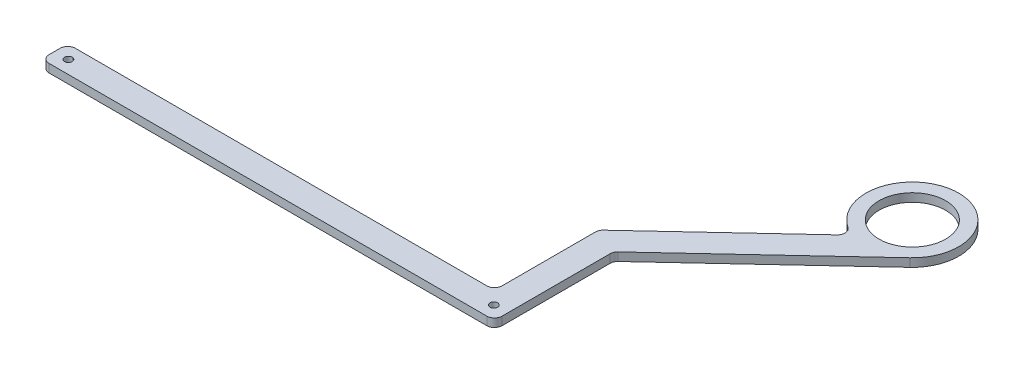
ISO-10303-21;
HEADER;
FILE_DESCRIPTION(('STEP AP214'),'2;1');
FILE_NAME('part.step','',(''),(''),'','','');
FILE_SCHEMA(('AUTOMOTIVE_DESIGN { 1 0 10303 214 1 1 1 1 }'));
ENDSEC;
DATA;
#1=APPLICATION_CONTEXT('core data for automotive mechanical design processes');
#2=APPLICATION_PROTOCOL_DEFINITION('international standard','automotive_design',2000,#1);
#3=PRODUCT_CONTEXT('',#1,'mechanical');
#4=PRODUCT('Part','Part','',(#3));
#5=PRODUCT_RELATED_PRODUCT_CATEGORY('part','',(#4));
#6=PRODUCT_DEFINITION_FORMATION('','',#4);
#7=PRODUCT_DEFINITION_CONTEXT('part definition',#1,'design');
#8=PRODUCT_DEFINITION('design','',#6,#7);
#9=PRODUCT_DEFINITION_SHAPE('','',#8);
#10=(LENGTH_UNIT() NAMED_UNIT(*) SI_UNIT(.MILLI.,.METRE.));
#11=(NAMED_UNIT(*) PLANE_ANGLE_UNIT() SI_UNIT($,.RADIAN.));
#12=(NAMED_UNIT(*) SI_UNIT($,.STERADIAN.) SOLID_ANGLE_UNIT());
#13=UNCERTAINTY_MEASURE_WITH_UNIT(LENGTH_MEASURE(1.E-05),#10,'distance_accuracy_value','');
#14=(GEOMETRIC_REPRESENTATION_CONTEXT(3) GLOBAL_UNCERTAINTY_ASSIGNED_CONTEXT((#13)) GLOBAL_UNIT_ASSIGNED_CONTEXT((#10,
#11,#12)) REPRESENTATION_CONTEXT('',''));
#15=CARTESIAN_POINT('',(0.,0.,0.));
#16=DIRECTION('',(0.,0.,1.));
#17=DIRECTION('',(1.,0.,0.));
#18=AXIS2_PLACEMENT_3D('',#15,#16,#17);
#19=CARTESIAN_POINT('',(219.136925156428,3.175,-112.894829323659));
#20=DIRECTION('',(0.,1.,0.));
#21=DIRECTION('',(0.,0.,1.));
#22=AXIS2_PLACEMENT_3D('',#19,#20,#21);
#23=PLANE('',#22);
#24=CARTESIAN_POINT('',(167.45,3.175,-5.));
#25=DIRECTION('',(0.,1.,0.));
#26=DIRECTION('',(0.,0.,1.));
#27=AXIS2_PLACEMENT_3D('',#24,#25,#26);
#28=CIRCLE('',#27,1.4605);
#29=CARTESIAN_POINT('',(167.45,3.175,-3.5395));
#30=VERTEX_POINT('',#29);
#31=EDGE_CURVE('E348',#30,#30,#28,.T.);
#32=ORIENTED_EDGE('',*,*,#31,.F.);
#33=EDGE_LOOP('',(#32));
#34=FACE_BOUND('',#33,.T.);
#35=DIRECTION('',(-0.731353701619171,0.,0.681998360062497));
#36=VECTOR('',#35,1.);
#37=CARTESIAN_POINT('',(212.732452536377,3.175,-96.3941405362471));
#38=LINE('',#37,#36);
#39=CARTESIAN_POINT('',(209.71766352743,3.175,-93.5828043038821));
#40=VERTEX_POINT('',#39);
#41=CARTESIAN_POINT('',(163.628882790257,3.175,-50.604320964778));
#42=VERTEX_POINT('',#41);
#43=EDGE_CURVE('E172',#40,#42,#38,.T.);
#44=ORIENTED_EDGE('',*,*,#43,.T.);
#45=CARTESIAN_POINT('',(165.621,3.175,-48.4680368023484));
#46=DIRECTION('',(0.,1.,0.));
#47=DIRECTION('',(0.,0.,1.));
#48=AXIS2_PLACEMENT_3D('',#45,#46,#47);
#49=CIRCLE('',#48,2.921);
#50=CARTESIAN_POINT('',(162.7,3.175,-48.4680368023484));
#51=VERTEX_POINT('',#50);
#52=EDGE_CURVE('E226',#42,#51,#49,.T.);
#53=ORIENTED_EDGE('',*,*,#52,.T.);
#54=DIRECTION('',(0.,0.,1.));
#55=VECTOR('',#54,1.);
#56=CARTESIAN_POINT('',(162.7,3.175,-49.7381237496093));
#57=LINE('',#56,#55);
#58=CARTESIAN_POINT('',(162.7,3.175,-12.921));
#59=VERTEX_POINT('',#58);
#60=EDGE_CURVE('E174',#51,#59,#57,.T.);
#61=ORIENTED_EDGE('',*,*,#60,.T.);
#62=CARTESIAN_POINT('',(159.779,3.175,-12.921));
#63=DIRECTION('',(0.,1.,0.));
#64=DIRECTION('',(0.,0.,1.));
#65=AXIS2_PLACEMENT_3D('',#62,#63,#64);
#66=CIRCLE('',#65,2.921);
#67=CARTESIAN_POINT('',(159.779,3.175,-10.));
#68=VERTEX_POINT('',#67);
#69=EDGE_CURVE('E59',#59,#68,#66,.F.);
#70=ORIENTED_EDGE('',*,*,#69,.T.);
#71=DIRECTION('',(-1.,0.,0.));
#72=VECTOR('',#71,1.);
#73=CARTESIAN_POINT('',(162.7,3.175,-10.));
#74=LINE('',#73,#72);
#75=CARTESIAN_POINT('',(2.92100000000001,3.175,-10.));
#76=VERTEX_POINT('',#75);
#77=EDGE_CURVE('E167',#68,#76,#74,.T.);
#78=ORIENTED_EDGE('',*,*,#77,.T.);
#79=CARTESIAN_POINT('',(2.921,3.175,-7.079));
#80=DIRECTION('',(0.,1.,0.));
#81=DIRECTION('',(0.,0.,1.));
#82=AXIS2_PLACEMENT_3D('',#79,#80,#81);
#83=CIRCLE('',#82,2.921);
#84=CARTESIAN_POINT('',(0.,3.175,-7.079));
#85=VERTEX_POINT('',#84);
#86=EDGE_CURVE('E222',#76,#85,#83,.T.);
#87=ORIENTED_EDGE('',*,*,#86,.T.);
#88=DIRECTION('',(0.,0.,1.));
#89=VECTOR('',#88,1.);
#90=CARTESIAN_POINT('',(0.,3.175,-10.));
#91=LINE('',#90,#89);
#92=CARTESIAN_POINT('',(0.,3.175,-2.921));
#93=VERTEX_POINT('',#92);
#94=EDGE_CURVE('E200',#85,#93,#91,.T.);
#95=ORIENTED_EDGE('',*,*,#94,.T.);
#96=CARTESIAN_POINT('',(2.921,3.175,-2.921));
#97=DIRECTION('',(0.,1.,0.));
#98=DIRECTION('',(0.,0.,1.));
#99=AXIS2_PLACEMENT_3D('',#96,#97,#98);
#100=CIRCLE('',#99,2.921);
#101=CARTESIAN_POINT('',(2.921,3.175,0.));
#102=VERTEX_POINT('',#101);
#103=EDGE_CURVE('E224',#93,#102,#100,.T.);
#104=ORIENTED_EDGE('',*,*,#103,.T.);
#105=DIRECTION('',(1.,0.,0.));
#106=VECTOR('',#105,1.);
#107=CARTESIAN_POINT('',(0.,3.175,0.));
#108=LINE('',#107,#106);
#109=CARTESIAN_POINT('',(169.779,3.175,0.));
#110=VERTEX_POINT('',#109);
#111=EDGE_CURVE('E337',#102,#110,#108,.T.);
#112=ORIENTED_EDGE('',*,*,#111,.T.);
#113=CARTESIAN_POINT('',(169.779,3.175,-2.921));
#114=DIRECTION('',(0.,1.,0.));
#115=DIRECTION('',(0.,0.,1.));
#116=AXIS2_PLACEMENT_3D('',#113,#114,#115);
#117=CIRCLE('',#116,2.921);
#118=CARTESIAN_POINT('',(172.7,3.175,-2.921));
#119=VERTEX_POINT('',#118);
#120=EDGE_CURVE('E220',#110,#119,#117,.T.);
#121=ORIENTED_EDGE('',*,*,#120,.T.);
#122=DIRECTION('',(0.,0.,-1.));
#123=VECTOR('',#122,1.);
#124=CARTESIAN_POINT('',(172.7,3.175,0.));
#125=LINE('',#124,#123);
#126=CARTESIAN_POINT('',(172.7,3.175,-44.1199130527391));
#127=VERTEX_POINT('',#126);
#128=EDGE_CURVE('E156',#119,#127,#125,.T.);
#129=ORIENTED_EDGE('',*,*,#128,.T.);
#130=CARTESIAN_POINT('',(175.621,3.175,-44.1199130527391));
#131=DIRECTION('',(0.,1.,0.));
#132=DIRECTION('',(0.,0.,1.));
#133=AXIS2_PLACEMENT_3D('',#130,#131,#132);
#134=CIRCLE('',#133,2.921);
#135=CARTESIAN_POINT('',(173.628882790257,3.175,-46.2561972151687));
#136=VERTEX_POINT('',#135);
#137=EDGE_CURVE('E11',#127,#136,#134,.F.);
#138=ORIENTED_EDGE('',*,*,#137,.T.);
#139=DIRECTION('',(0.731353701619172,0.,-0.681998360062497));
#140=VECTOR('',#139,1.);
#141=CARTESIAN_POINT('',(172.7,3.175,-45.39));
#142=LINE('',#141,#140);
#143=CARTESIAN_POINT('',(231.208296129534,3.175,-99.9498688049997));
#144=VERTEX_POINT('',#143);
#145=EDGE_CURVE('E144',#136,#144,#142,.T.);
#146=ORIENTED_EDGE('',*,*,#145,.T.);
#147=CARTESIAN_POINT('',(219.136925156428,3.175,-112.894829323659));
#148=DIRECTION('',(0.,1.,0.));
#149=DIRECTION('',(0.,0.,1.));
#150=AXIS2_PLACEMENT_3D('',#147,#148,#149);
#151=CIRCLE('',#150,17.7);
#152=CARTESIAN_POINT('',(209.3419876924,3.175,-98.1520616026441));
#153=VERTEX_POINT('',#152);
#154=EDGE_CURVE('E149',#144,#153,#151,.T.);
#155=ORIENTED_EDGE('',*,*,#154,.T.);
#156=CARTESIAN_POINT('',(207.725546317687,3.175,-95.7190884663117));
#157=DIRECTION('',(0.,1.,0.));
#158=DIRECTION('',(0.,0.,1.));
#159=AXIS2_PLACEMENT_3D('',#156,#157,#158);
#160=CIRCLE('',#159,2.921);
#161=EDGE_CURVE('E251',#153,#40,#160,.F.);
#162=ORIENTED_EDGE('',*,*,#161,.T.);
#163=EDGE_LOOP('',(#44,#53,#61,#70,#78,#87,#95,#104,#112,#121,#129,#138,#146,#155,#162));
#164=FACE_BOUND('',#163,.T.);
#165=CARTESIAN_POINT('',(5.25,3.175,-5.));
#166=DIRECTION('',(0.,1.,0.));
#167=DIRECTION('',(0.,0.,1.));
#168=AXIS2_PLACEMENT_3D('',#165,#166,#167);
#169=CIRCLE('',#168,1.4605);
#170=CARTESIAN_POINT('',(5.25,3.175,-3.5395));
#171=VERTEX_POINT('',#170);
#172=EDGE_CURVE('E184',#171,#171,#169,.T.);
#173=ORIENTED_EDGE('',*,*,#172,.F.);
#174=EDGE_LOOP('',(#173));
#175=FACE_BOUND('',#174,.T.);
#176=CARTESIAN_POINT('',(219.136925156428,3.175,-112.894829323659));
#177=DIRECTION('',(0.,1.,0.));
#178=DIRECTION('',(0.,0.,1.));
#179=AXIS2_PLACEMENT_3D('',#176,#177,#178);
#180=CIRCLE('',#179,12.7);
#181=CARTESIAN_POINT('',(219.136925156428,3.175,-100.194829323659));
#182=VERTEX_POINT('',#181);
#183=EDGE_CURVE('E354',#182,#182,#180,.T.);
#184=ORIENTED_EDGE('',*,*,#183,.F.);
#185=EDGE_LOOP('',(#184));
#186=FACE_BOUND('',#185,.T.);
#187=ADVANCED_FACE('F37',(#34,#164,#175,#186),#23,.T.);
#188=CARTESIAN_POINT('',(219.136925156428,0.,-112.894829323659));
#189=DIRECTION('',(0.,1.,0.));
#190=DIRECTION('',(0.,0.,1.));
#191=AXIS2_PLACEMENT_3D('',#188,#189,#190);
#192=PLANE('',#191);
#193=DIRECTION('',(0.,0.,1.));
#194=VECTOR('',#193,1.);
#195=CARTESIAN_POINT('',(162.7,0.,-49.7381237496093));
#196=LINE('',#195,#194);
#197=CARTESIAN_POINT('',(162.7,0.,-48.4680368023484));
#198=VERTEX_POINT('',#197);
#199=CARTESIAN_POINT('',(162.7,0.,-12.921));
#200=VERTEX_POINT('',#199);
#201=EDGE_CURVE('E196',#198,#200,#196,.T.);
#202=ORIENTED_EDGE('',*,*,#201,.F.);
#203=CARTESIAN_POINT('',(165.621,0.,-48.4680368023484));
#204=DIRECTION('',(0.,1.,0.));
#205=DIRECTION('',(0.,0.,1.));
#206=AXIS2_PLACEMENT_3D('',#203,#204,#205);
#207=CIRCLE('',#206,2.921);
#208=CARTESIAN_POINT('',(163.628882790257,0.,-50.604320964778));
#209=VERTEX_POINT('',#208);
#210=EDGE_CURVE('E218',#198,#209,#207,.F.);
#211=ORIENTED_EDGE('',*,*,#210,.T.);
#212=DIRECTION('',(-0.731353701619171,0.,0.681998360062497));
#213=VECTOR('',#212,1.);
#214=CARTESIAN_POINT('',(212.732452536377,0.,-96.3941405362471));
#215=LINE('',#214,#213);
#216=CARTESIAN_POINT('',(209.71766352743,0.,-93.5828043038821));
#217=VERTEX_POINT('',#216);
#218=EDGE_CURVE('E193',#217,#209,#215,.T.);
#219=ORIENTED_EDGE('',*,*,#218,.F.);
#220=CARTESIAN_POINT('',(207.725546317687,0.,-95.7190884663117));
#221=DIRECTION('',(0.,1.,0.));
#222=DIRECTION('',(0.,0.,1.));
#223=AXIS2_PLACEMENT_3D('',#220,#221,#222);
#224=CIRCLE('',#223,2.921);
#225=CARTESIAN_POINT('',(209.3419876924,0.,-98.1520616026441));
#226=VERTEX_POINT('',#225);
#227=EDGE_CURVE('E249',#217,#226,#224,.T.);
#228=ORIENTED_EDGE('',*,*,#227,.T.);
#229=CARTESIAN_POINT('',(219.136925156428,0.,-112.894829323659));
#230=DIRECTION('',(0.,1.,0.));
#231=DIRECTION('',(0.,0.,1.));
#232=AXIS2_PLACEMENT_3D('',#229,#230,#231);
#233=CIRCLE('',#232,17.7);
#234=CARTESIAN_POINT('',(231.208296129534,0.,-99.9498688049997));
#235=VERTEX_POINT('',#234);
#236=EDGE_CURVE('E191',#235,#226,#233,.T.);
#237=ORIENTED_EDGE('',*,*,#236,.F.);
#238=DIRECTION('',(0.731353701619172,0.,-0.681998360062497));
#239=VECTOR('',#238,1.);
#240=CARTESIAN_POINT('',(172.7,0.,-45.39));
#241=LINE('',#240,#239);
#242=CARTESIAN_POINT('',(173.628882790257,0.,-46.2561972151687));
#243=VERTEX_POINT('',#242);
#244=EDGE_CURVE('E162',#243,#235,#241,.T.);
#245=ORIENTED_EDGE('',*,*,#244,.F.);
#246=CARTESIAN_POINT('',(175.621,0.,-44.1199130527391));
#247=DIRECTION('',(0.,1.,0.));
#248=DIRECTION('',(0.,0.,1.));
#249=AXIS2_PLACEMENT_3D('',#246,#247,#248);
#250=CIRCLE('',#249,2.921);
#251=CARTESIAN_POINT('',(172.7,0.,-44.1199130527391));
#252=VERTEX_POINT('',#251);
#253=EDGE_CURVE('E45',#243,#252,#250,.T.);
#254=ORIENTED_EDGE('',*,*,#253,.T.);
#255=DIRECTION('',(0.,0.,-1.));
#256=VECTOR('',#255,1.);
#257=CARTESIAN_POINT('',(172.7,0.,0.));
#258=LINE('',#257,#256);
#259=CARTESIAN_POINT('',(172.7,0.,-2.921));
#260=VERTEX_POINT('',#259);
#261=EDGE_CURVE('E187',#260,#252,#258,.T.);
#262=ORIENTED_EDGE('',*,*,#261,.F.);
#263=CARTESIAN_POINT('',(169.779,0.,-2.921));
#264=DIRECTION('',(0.,1.,0.));
#265=DIRECTION('',(0.,0.,1.));
#266=AXIS2_PLACEMENT_3D('',#263,#264,#265);
#267=CIRCLE('',#266,2.921);
#268=CARTESIAN_POINT('',(169.779,0.,0.));
#269=VERTEX_POINT('',#268);
#270=EDGE_CURVE('E212',#260,#269,#267,.F.);
#271=ORIENTED_EDGE('',*,*,#270,.T.);
#272=DIRECTION('',(1.,0.,0.));
#273=VECTOR('',#272,1.);
#274=CARTESIAN_POINT('',(0.,0.,0.));
#275=LINE('',#274,#273);
#276=CARTESIAN_POINT('',(2.921,0.,0.));
#277=VERTEX_POINT('',#276);
#278=EDGE_CURVE('E183',#277,#269,#275,.T.);
#279=ORIENTED_EDGE('',*,*,#278,.F.);
#280=CARTESIAN_POINT('',(2.921,0.,-2.921));
#281=DIRECTION('',(0.,1.,0.));
#282=DIRECTION('',(0.,0.,1.));
#283=AXIS2_PLACEMENT_3D('',#280,#281,#282);
#284=CIRCLE('',#283,2.921);
#285=CARTESIAN_POINT('',(0.,0.,-2.921));
#286=VERTEX_POINT('',#285);
#287=EDGE_CURVE('E216',#277,#286,#284,.F.);
#288=ORIENTED_EDGE('',*,*,#287,.T.);
#289=DIRECTION('',(0.,0.,1.));
#290=VECTOR('',#289,1.);
#291=CARTESIAN_POINT('',(0.,0.,-10.));
#292=LINE('',#291,#290);
#293=CARTESIAN_POINT('',(0.,0.,-7.079));
#294=VERTEX_POINT('',#293);
#295=EDGE_CURVE('E180',#294,#286,#292,.T.);
#296=ORIENTED_EDGE('',*,*,#295,.F.);
#297=CARTESIAN_POINT('',(2.921,0.,-7.079));
#298=DIRECTION('',(0.,1.,0.));
#299=DIRECTION('',(0.,0.,1.));
#300=AXIS2_PLACEMENT_3D('',#297,#298,#299);
#301=CIRCLE('',#300,2.921);
#302=CARTESIAN_POINT('',(2.92100000000001,0.,-10.));
#303=VERTEX_POINT('',#302);
#304=EDGE_CURVE('E214',#294,#303,#301,.F.);
#305=ORIENTED_EDGE('',*,*,#304,.T.);
#306=DIRECTION('',(-1.,0.,0.));
#307=VECTOR('',#306,1.);
#308=CARTESIAN_POINT('',(162.7,0.,-10.));
#309=LINE('',#308,#307);
#310=CARTESIAN_POINT('',(159.779,0.,-10.));
#311=VERTEX_POINT('',#310);
#312=EDGE_CURVE('E199',#311,#303,#309,.T.);
#313=ORIENTED_EDGE('',*,*,#312,.F.);
#314=CARTESIAN_POINT('',(159.779,0.,-12.921));
#315=DIRECTION('',(0.,1.,0.));
#316=DIRECTION('',(0.,0.,1.));
#317=AXIS2_PLACEMENT_3D('',#314,#315,#316);
#318=CIRCLE('',#317,2.921);
#319=EDGE_CURVE('E253',#311,#200,#318,.T.);
#320=ORIENTED_EDGE('',*,*,#319,.T.);
#321=EDGE_LOOP('',(#202,#211,#219,#228,#237,#245,#254,#262,#271,#279,#288,#296,#305,#313,#320));
#322=FACE_BOUND('',#321,.T.);
#323=CARTESIAN_POINT('',(5.25,0.,-5.));
#324=DIRECTION('',(0.,1.,0.));
#325=DIRECTION('',(0.,0.,1.));
#326=AXIS2_PLACEMENT_3D('',#323,#324,#325);
#327=CIRCLE('',#326,1.4605);
#328=CARTESIAN_POINT('',(5.25,0.,-3.5395));
#329=VERTEX_POINT('',#328);
#330=EDGE_CURVE('E345',#329,#329,#327,.T.);
#331=ORIENTED_EDGE('',*,*,#330,.T.);
#332=EDGE_LOOP('',(#331));
#333=FACE_BOUND('',#332,.T.);
#334=CARTESIAN_POINT('',(167.45,0.,-5.));
#335=DIRECTION('',(0.,1.,0.));
#336=DIRECTION('',(0.,0.,1.));
#337=AXIS2_PLACEMENT_3D('',#334,#335,#336);
#338=CIRCLE('',#337,1.4605);
#339=CARTESIAN_POINT('',(167.45,0.,-3.5395));
#340=VERTEX_POINT('',#339);
#341=EDGE_CURVE('E351',#340,#340,#338,.T.);
#342=ORIENTED_EDGE('',*,*,#341,.T.);
#343=EDGE_LOOP('',(#342));
#344=FACE_BOUND('',#343,.T.);
#345=CARTESIAN_POINT('',(219.136925156428,0.,-112.894829323659));
#346=DIRECTION('',(0.,1.,0.));
#347=DIRECTION('',(0.,0.,1.));
#348=AXIS2_PLACEMENT_3D('',#345,#346,#347);
#349=CIRCLE('',#348,12.7);
#350=CARTESIAN_POINT('',(219.136925156428,0.,-100.194829323659));
#351=VERTEX_POINT('',#350);
#352=EDGE_CURVE('E357',#351,#351,#349,.T.);
#353=ORIENTED_EDGE('',*,*,#352,.T.);
#354=EDGE_LOOP('',(#353));
#355=FACE_BOUND('',#354,.T.);
#356=ADVANCED_FACE('F258',(#322,#333,#344,#355),#192,.F.);
#357=CARTESIAN_POINT('',(0.,3.175,-10.));
#358=DIRECTION('',(1.,0.,0.));
#359=DIRECTION('',(0.,0.,-1.));
#360=AXIS2_PLACEMENT_3D('',#357,#358,#359);
#361=PLANE('',#360);
#362=ORIENTED_EDGE('',*,*,#295,.T.);
#363=DIRECTION('',(0.,-1.,0.));
#364=VECTOR('',#363,1.);
#365=CARTESIAN_POINT('',(0.,3.175,-2.921));
#366=LINE('',#365,#364);
#367=EDGE_CURVE('E240',#286,#93,#366,.F.);
#368=ORIENTED_EDGE('',*,*,#367,.T.);
#369=ORIENTED_EDGE('',*,*,#94,.F.);
#370=DIRECTION('',(0.,-1.,0.));
#371=VECTOR('',#370,1.);
#372=CARTESIAN_POINT('',(0.,3.175,-7.079));
#373=LINE('',#372,#371);
#374=EDGE_CURVE('E237',#85,#294,#373,.T.);
#375=ORIENTED_EDGE('',*,*,#374,.T.);
#376=EDGE_LOOP('',(#362,#368,#369,#375));
#377=FACE_BOUND('',#376,.T.);
#378=ADVANCED_FACE('F283',(#377),#361,.F.);
#379=CARTESIAN_POINT('',(0.,3.175,0.));
#380=DIRECTION('',(0.,0.,-1.));
#381=DIRECTION('',(-1.,0.,0.));
#382=AXIS2_PLACEMENT_3D('',#379,#380,#381);
#383=PLANE('',#382);
#384=ORIENTED_EDGE('',*,*,#111,.F.);
#385=DIRECTION('',(0.,-1.,0.));
#386=VECTOR('',#385,1.);
#387=CARTESIAN_POINT('',(2.921,3.175,0.));
#388=LINE('',#387,#386);
#389=EDGE_CURVE('E234',#102,#277,#388,.T.);
#390=ORIENTED_EDGE('',*,*,#389,.T.);
#391=ORIENTED_EDGE('',*,*,#278,.T.);
#392=DIRECTION('',(0.,-1.,0.));
#393=VECTOR('',#392,1.);
#394=CARTESIAN_POINT('',(169.779,3.175,0.));
#395=LINE('',#394,#393);
#396=EDGE_CURVE('E232',#269,#110,#395,.F.);
#397=ORIENTED_EDGE('',*,*,#396,.T.);
#398=EDGE_LOOP('',(#384,#390,#391,#397));
#399=FACE_BOUND('',#398,.T.);
#400=ADVANCED_FACE('F307',(#399),#383,.F.);
#401=CARTESIAN_POINT('',(172.7,3.175,0.));
#402=DIRECTION('',(-1.,0.,0.));
#403=DIRECTION('',(0.,0.,1.));
#404=AXIS2_PLACEMENT_3D('',#401,#402,#403);
#405=PLANE('',#404);
#406=ORIENTED_EDGE('',*,*,#261,.T.);
#407=DIRECTION('',(0.,-1.,0.));
#408=VECTOR('',#407,1.);
#409=CARTESIAN_POINT('',(172.7,3.175,-44.1199130527391));
#410=LINE('',#409,#408);
#411=EDGE_CURVE('E247',#252,#127,#410,.F.);
#412=ORIENTED_EDGE('',*,*,#411,.T.);
#413=ORIENTED_EDGE('',*,*,#128,.F.);
#414=DIRECTION('',(0.,-1.,0.));
#415=VECTOR('',#414,1.);
#416=CARTESIAN_POINT('',(172.7,3.175,-2.921));
#417=LINE('',#416,#415);
#418=EDGE_CURVE('E244',#119,#260,#417,.T.);
#419=ORIENTED_EDGE('',*,*,#418,.T.);
#420=EDGE_LOOP('',(#406,#412,#413,#419));
#421=FACE_BOUND('',#420,.T.);
#422=ADVANCED_FACE('F263',(#421),#405,.F.);
#423=CARTESIAN_POINT('',(172.7,3.175,-45.39));
#424=DIRECTION('',(-0.681998360062497,0.,-0.731353701619172));
#425=DIRECTION('',(-0.731353701619172,0.,0.681998360062497));
#426=AXIS2_PLACEMENT_3D('',#423,#424,#425);
#427=PLANE('',#426);
#428=ORIENTED_EDGE('',*,*,#145,.F.);
#429=DIRECTION('',(0.,-1.,0.));
#430=VECTOR('',#429,1.);
#431=CARTESIAN_POINT('',(173.628882790257,0.,-46.2561972151687));
#432=LINE('',#431,#430);
#433=EDGE_CURVE('E242',#136,#243,#432,.T.);
#434=ORIENTED_EDGE('',*,*,#433,.T.);
#435=ORIENTED_EDGE('',*,*,#244,.T.);
#436=DIRECTION('',(0.,-1.,0.));
#437=VECTOR('',#436,1.);
#438=CARTESIAN_POINT('',(231.208296129534,3.175,-99.9498688049997));
#439=LINE('',#438,#437);
#440=EDGE_CURVE('E159',#144,#235,#439,.T.);
#441=ORIENTED_EDGE('',*,*,#440,.F.);
#442=EDGE_LOOP('',(#428,#434,#435,#441));
#443=FACE_BOUND('',#442,.T.);
#444=ADVANCED_FACE('F160',(#443),#427,.F.);
#445=CARTESIAN_POINT('',(219.136925156428,3.175,-112.894829323659));
#446=DIRECTION('',(0.,-1.,0.));
#447=DIRECTION('',(0.,0.,-1.));
#448=AXIS2_PLACEMENT_3D('',#445,#446,#447);
#449=CYLINDRICAL_SURFACE('',#448,17.7);
#450=ORIENTED_EDGE('',*,*,#236,.T.);
#451=DIRECTION('',(0.,-1.,0.));
#452=VECTOR('',#451,1.);
#453=CARTESIAN_POINT('',(209.3419876924,3.175,-98.1520616026441));
#454=LINE('',#453,#452);
#455=EDGE_CURVE('E171',#226,#153,#454,.F.);
#456=ORIENTED_EDGE('',*,*,#455,.T.);
#457=ORIENTED_EDGE('',*,*,#154,.F.);
#458=ORIENTED_EDGE('',*,*,#440,.T.);
#459=EDGE_LOOP('',(#450,#456,#457,#458));
#460=FACE_BOUND('',#459,.T.);
#461=ADVANCED_FACE('F169',(#460),#449,.T.);
#462=CARTESIAN_POINT('',(212.732452536377,3.175,-96.3941405362471));
#463=DIRECTION('',(0.681998360062497,0.,0.731353701619171));
#464=DIRECTION('',(0.731353701619171,0.,-0.681998360062497));
#465=AXIS2_PLACEMENT_3D('',#462,#463,#464);
#466=PLANE('',#465);
#467=ORIENTED_EDGE('',*,*,#43,.F.);
#468=DIRECTION('',(0.,1.,0.));
#469=VECTOR('',#468,1.);
#470=CARTESIAN_POINT('',(209.71766352743,0.,-93.5828043038821));
#471=LINE('',#470,#469);
#472=EDGE_CURVE('E203',#40,#217,#471,.F.);
#473=ORIENTED_EDGE('',*,*,#472,.T.);
#474=ORIENTED_EDGE('',*,*,#218,.T.);
#475=DIRECTION('',(0.,-1.,0.));
#476=VECTOR('',#475,1.);
#477=CARTESIAN_POINT('',(163.628882790257,3.175,-50.604320964778));
#478=LINE('',#477,#476);
#479=EDGE_CURVE('E166',#209,#42,#478,.F.);
#480=ORIENTED_EDGE('',*,*,#479,.T.);
#481=EDGE_LOOP('',(#467,#473,#474,#480));
#482=FACE_BOUND('',#481,.T.);
#483=ADVANCED_FACE('F296',(#482),#466,.F.);
#484=CARTESIAN_POINT('',(162.7,3.175,-49.7381237496093));
#485=DIRECTION('',(1.,0.,0.));
#486=DIRECTION('',(0.,0.,-1.));
#487=AXIS2_PLACEMENT_3D('',#484,#485,#486);
#488=PLANE('',#487);
#489=ORIENTED_EDGE('',*,*,#60,.F.);
#490=DIRECTION('',(0.,-1.,0.));
#491=VECTOR('',#490,1.);
#492=CARTESIAN_POINT('',(162.7,3.175,-48.4680368023484));
#493=LINE('',#492,#491);
#494=EDGE_CURVE('E209',#51,#198,#493,.T.);
#495=ORIENTED_EDGE('',*,*,#494,.T.);
#496=ORIENTED_EDGE('',*,*,#201,.T.);
#497=DIRECTION('',(0.,-1.,0.));
#498=VECTOR('',#497,1.);
#499=CARTESIAN_POINT('',(162.7,3.175,-12.921));
#500=LINE('',#499,#498);
#501=EDGE_CURVE('E207',#200,#59,#500,.F.);
#502=ORIENTED_EDGE('',*,*,#501,.T.);
#503=EDGE_LOOP('',(#489,#495,#496,#502));
#504=FACE_BOUND('',#503,.T.);
#505=ADVANCED_FACE('F293',(#504),#488,.F.);
#506=CARTESIAN_POINT('',(162.7,3.175,-10.));
#507=DIRECTION('',(0.,0.,1.));
#508=DIRECTION('',(1.,0.,0.));
#509=AXIS2_PLACEMENT_3D('',#506,#507,#508);
#510=PLANE('',#509);
#511=ORIENTED_EDGE('',*,*,#77,.F.);
#512=DIRECTION('',(0.,-1.,0.));
#513=VECTOR('',#512,1.);
#514=CARTESIAN_POINT('',(159.779,0.,-10.));
#515=LINE('',#514,#513);
#516=EDGE_CURVE('E229',#68,#311,#515,.T.);
#517=ORIENTED_EDGE('',*,*,#516,.T.);
#518=ORIENTED_EDGE('',*,*,#312,.T.);
#519=DIRECTION('',(0.,-1.,0.));
#520=VECTOR('',#519,1.);
#521=CARTESIAN_POINT('',(2.92100000000001,3.175,-10.));
#522=LINE('',#521,#520);
#523=EDGE_CURVE('E52',#303,#76,#522,.F.);
#524=ORIENTED_EDGE('',*,*,#523,.T.);
#525=EDGE_LOOP('',(#511,#517,#518,#524));
#526=FACE_BOUND('',#525,.T.);
#527=ADVANCED_FACE('F290',(#526),#510,.F.);
#528=CARTESIAN_POINT('',(5.25,3.175,-5.));
#529=DIRECTION('',(0.,-1.,0.));
#530=DIRECTION('',(0.,0.,-1.));
#531=AXIS2_PLACEMENT_3D('',#528,#529,#530);
#532=CYLINDRICAL_SURFACE('',#531,1.4605);
#533=ORIENTED_EDGE('',*,*,#172,.T.);
#534=EDGE_LOOP('',(#533));
#535=FACE_BOUND('',#534,.T.);
#536=ORIENTED_EDGE('',*,*,#330,.F.);
#537=EDGE_LOOP('',(#536));
#538=FACE_BOUND('',#537,.T.);
#539=ADVANCED_FACE('F287',(#535,#538),#532,.F.);
#540=CARTESIAN_POINT('',(167.45,3.175,-5.));
#541=DIRECTION('',(0.,-1.,0.));
#542=DIRECTION('',(0.,0.,-1.));
#543=AXIS2_PLACEMENT_3D('',#540,#541,#542);
#544=CYLINDRICAL_SURFACE('',#543,1.4605);
#545=ORIENTED_EDGE('',*,*,#31,.T.);
#546=EDGE_LOOP('',(#545));
#547=FACE_BOUND('',#546,.T.);
#548=ORIENTED_EDGE('',*,*,#341,.F.);
#549=EDGE_LOOP('',(#548));
#550=FACE_BOUND('',#549,.T.);
#551=ADVANCED_FACE('F366',(#547,#550),#544,.F.);
#552=CARTESIAN_POINT('',(219.136925156428,3.175,-112.894829323659));
#553=DIRECTION('',(0.,-1.,0.));
#554=DIRECTION('',(0.,0.,-1.));
#555=AXIS2_PLACEMENT_3D('',#552,#553,#554);
#556=CYLINDRICAL_SURFACE('',#555,12.7);
#557=ORIENTED_EDGE('',*,*,#183,.T.);
#558=EDGE_LOOP('',(#557));
#559=FACE_BOUND('',#558,.T.);
#560=ORIENTED_EDGE('',*,*,#352,.F.);
#561=EDGE_LOOP('',(#560));
#562=FACE_BOUND('',#561,.T.);
#563=ADVANCED_FACE('F318',(#559,#562),#556,.F.);
#564=CARTESIAN_POINT('',(207.725546317687,3.175,-95.7190884663117));
#565=DIRECTION('',(0.,-1.,0.));
#566=DIRECTION('',(0.,0.,-1.));
#567=AXIS2_PLACEMENT_3D('',#564,#565,#566);
#568=CYLINDRICAL_SURFACE('',#567,2.921);
#569=ORIENTED_EDGE('',*,*,#161,.F.);
#570=ORIENTED_EDGE('',*,*,#455,.F.);
#571=ORIENTED_EDGE('',*,*,#227,.F.);
#572=ORIENTED_EDGE('',*,*,#472,.F.);
#573=EDGE_LOOP('',(#569,#570,#571,#572));
#574=FACE_BOUND('',#573,.T.);
#575=ADVANCED_FACE('F314',(#574),#568,.F.);
#576=CARTESIAN_POINT('',(165.621,3.175,-48.4680368023484));
#577=DIRECTION('',(0.,-1.,0.));
#578=DIRECTION('',(0.,0.,-1.));
#579=AXIS2_PLACEMENT_3D('',#576,#577,#578);
#580=CYLINDRICAL_SURFACE('',#579,2.921);
#581=ORIENTED_EDGE('',*,*,#52,.F.);
#582=ORIENTED_EDGE('',*,*,#479,.F.);
#583=ORIENTED_EDGE('',*,*,#210,.F.);
#584=ORIENTED_EDGE('',*,*,#494,.F.);
#585=EDGE_LOOP('',(#581,#582,#583,#584));
#586=FACE_BOUND('',#585,.T.);
#587=ADVANCED_FACE('F317',(#586),#580,.T.);
#588=CARTESIAN_POINT('',(159.779,3.175,-12.921));
#589=DIRECTION('',(0.,1.,0.));
#590=DIRECTION('',(0.,0.,1.));
#591=AXIS2_PLACEMENT_3D('',#588,#589,#590);
#592=CYLINDRICAL_SURFACE('',#591,2.921);
#593=ORIENTED_EDGE('',*,*,#69,.F.);
#594=ORIENTED_EDGE('',*,*,#501,.F.);
#595=ORIENTED_EDGE('',*,*,#319,.F.);
#596=ORIENTED_EDGE('',*,*,#516,.F.);
#597=EDGE_LOOP('',(#593,#594,#595,#596));
#598=FACE_BOUND('',#597,.T.);
#599=ADVANCED_FACE('F322',(#598),#592,.F.);
#600=CARTESIAN_POINT('',(2.921,3.175,-2.921));
#601=DIRECTION('',(0.,-1.,0.));
#602=DIRECTION('',(0.,0.,-1.));
#603=AXIS2_PLACEMENT_3D('',#600,#601,#602);
#604=CYLINDRICAL_SURFACE('',#603,2.921);
#605=ORIENTED_EDGE('',*,*,#103,.F.);
#606=ORIENTED_EDGE('',*,*,#367,.F.);
#607=ORIENTED_EDGE('',*,*,#287,.F.);
#608=ORIENTED_EDGE('',*,*,#389,.F.);
#609=EDGE_LOOP('',(#605,#606,#607,#608));
#610=FACE_BOUND('',#609,.T.);
#611=ADVANCED_FACE('F274',(#610),#604,.T.);
#612=CARTESIAN_POINT('',(2.921,3.175,-7.079));
#613=DIRECTION('',(0.,-1.,0.));
#614=DIRECTION('',(0.,0.,-1.));
#615=AXIS2_PLACEMENT_3D('',#612,#613,#614);
#616=CYLINDRICAL_SURFACE('',#615,2.921);
#617=ORIENTED_EDGE('',*,*,#86,.F.);
#618=ORIENTED_EDGE('',*,*,#523,.F.);
#619=ORIENTED_EDGE('',*,*,#304,.F.);
#620=ORIENTED_EDGE('',*,*,#374,.F.);
#621=EDGE_LOOP('',(#617,#618,#619,#620));
#622=FACE_BOUND('',#621,.T.);
#623=ADVANCED_FACE('F268',(#622),#616,.T.);
#624=CARTESIAN_POINT('',(175.621,3.175,-44.1199130527391));
#625=DIRECTION('',(0.,1.,0.));
#626=DIRECTION('',(0.,0.,1.));
#627=AXIS2_PLACEMENT_3D('',#624,#625,#626);
#628=CYLINDRICAL_SURFACE('',#627,2.921);
#629=ORIENTED_EDGE('',*,*,#137,.F.);
#630=ORIENTED_EDGE('',*,*,#411,.F.);
#631=ORIENTED_EDGE('',*,*,#253,.F.);
#632=ORIENTED_EDGE('',*,*,#433,.F.);
#633=EDGE_LOOP('',(#629,#630,#631,#632));
#634=FACE_BOUND('',#633,.T.);
#635=ADVANCED_FACE('F266',(#634),#628,.F.);
#636=CARTESIAN_POINT('',(169.779,3.175,-2.921));
#637=DIRECTION('',(0.,-1.,0.));
#638=DIRECTION('',(0.,0.,-1.));
#639=AXIS2_PLACEMENT_3D('',#636,#637,#638);
#640=CYLINDRICAL_SURFACE('',#639,2.921);
#641=ORIENTED_EDGE('',*,*,#120,.F.);
#642=ORIENTED_EDGE('',*,*,#396,.F.);
#643=ORIENTED_EDGE('',*,*,#270,.F.);
#644=ORIENTED_EDGE('',*,*,#418,.F.);
#645=EDGE_LOOP('',(#641,#642,#643,#644));
#646=FACE_BOUND('',#645,.T.);
#647=ADVANCED_FACE('F39',(#646),#640,.T.);
#648=CLOSED_SHELL('',(#187,#356,#378,#400,#422,#444,#461,#483,#505,#527,#539,#551,#563,#575,
#587,#599,#611,#623,#635,#647));
#649=MANIFOLD_SOLID_BREP('B2',#648);
#650=ADVANCED_BREP_SHAPE_REPRESENTATION('',(#18,#649),#14);
#651=SHAPE_DEFINITION_REPRESENTATION(#9,#650);
ENDSEC;
END-ISO-10303-21;
